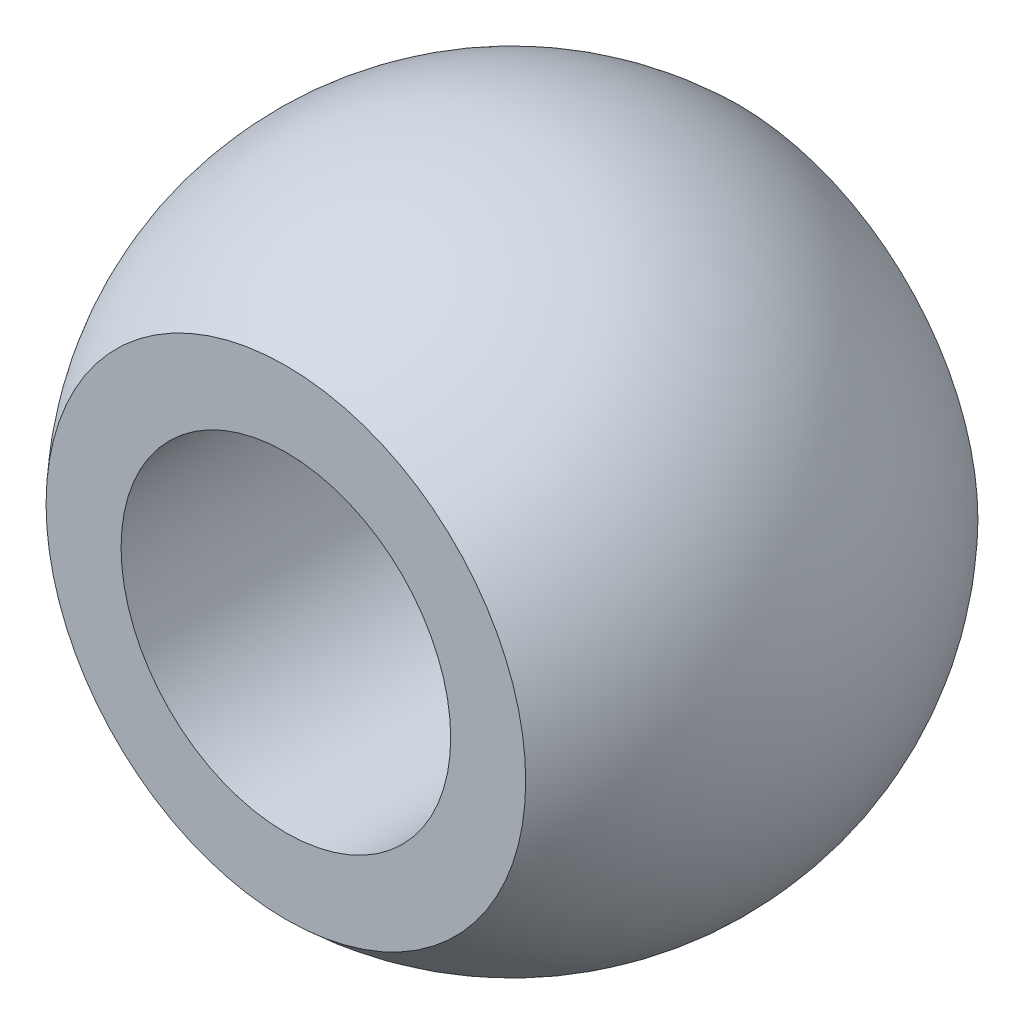
ISO-10303-21;
HEADER;
FILE_DESCRIPTION(('STEP AP214'),'2;1');
FILE_NAME('part.step','',(''),(''),'','','');
FILE_SCHEMA(('AUTOMOTIVE_DESIGN { 1 0 10303 214 1 1 1 1 }'));
ENDSEC;
DATA;
#1=APPLICATION_CONTEXT('core data for automotive mechanical design processes');
#2=APPLICATION_PROTOCOL_DEFINITION('international standard','automotive_design',2000,#1);
#3=PRODUCT_CONTEXT('',#1,'mechanical');
#4=PRODUCT('Part','Part','',(#3));
#5=PRODUCT_RELATED_PRODUCT_CATEGORY('part','',(#4));
#6=PRODUCT_DEFINITION_FORMATION('','',#4);
#7=PRODUCT_DEFINITION_CONTEXT('part definition',#1,'design');
#8=PRODUCT_DEFINITION('design','',#6,#7);
#9=PRODUCT_DEFINITION_SHAPE('','',#8);
#10=(LENGTH_UNIT() NAMED_UNIT(*) SI_UNIT(.MILLI.,.METRE.));
#11=(NAMED_UNIT(*) PLANE_ANGLE_UNIT() SI_UNIT($,.RADIAN.));
#12=(NAMED_UNIT(*) SI_UNIT($,.STERADIAN.) SOLID_ANGLE_UNIT());
#13=UNCERTAINTY_MEASURE_WITH_UNIT(LENGTH_MEASURE(1.E-05),#10,'distance_accuracy_value','');
#14=(GEOMETRIC_REPRESENTATION_CONTEXT(3) GLOBAL_UNCERTAINTY_ASSIGNED_CONTEXT((#13)) GLOBAL_UNIT_ASSIGNED_CONTEXT((#10,
#11,#12)) REPRESENTATION_CONTEXT('',''));
#15=CARTESIAN_POINT('',(0.,0.,0.));
#16=DIRECTION('',(0.,0.,1.));
#17=DIRECTION('',(1.,0.,0.));
#18=AXIS2_PLACEMENT_3D('',#15,#16,#17);
#19=CARTESIAN_POINT('',(0.,0.,0.));
#20=DIRECTION('',(0.,-1.,0.));
#21=DIRECTION('',(-1.,0.,0.));
#22=AXIS2_PLACEMENT_3D('',#19,#20,#21);
#23=SPHERICAL_SURFACE('',#22,6.35);
#24=CARTESIAN_POINT('',(0.,0.,0.));
#25=DIRECTION('',(0.,0.,1.));
#26=DIRECTION('',(1.,0.,0.));
#27=AXIS2_PLACEMENT_3D('',#24,#25,#26);
#28=SPHERICAL_SURFACE('',#27,6.35);
#29=CARTESIAN_POINT('',(0.,0.,-4.3561));
#30=DIRECTION('',(0.,0.,1.));
#31=DIRECTION('',(1.,0.,0.));
#32=AXIS2_PLACEMENT_3D('',#29,#30,#31);
#33=CIRCLE('',#32,4.62026977459109);
#34=CARTESIAN_POINT('',(4.62026977459109,0.,-4.3561));
#35=VERTEX_POINT('',#34);
#36=EDGE_CURVE('E47',#35,#35,#33,.F.);
#37=ORIENTED_EDGE('',*,*,#36,.F.);
#38=EDGE_LOOP('',(#37));
#39=FACE_BOUND('',#38,.T.);
#40=CARTESIAN_POINT('',(0.,0.,4.3561));
#41=DIRECTION('',(0.,0.,-1.));
#42=DIRECTION('',(-1.,0.,0.));
#43=AXIS2_PLACEMENT_3D('',#40,#41,#42);
#44=CIRCLE('',#43,4.62026977459109);
#45=CARTESIAN_POINT('',(-4.62026977459109,0.,4.3561));
#46=VERTEX_POINT('',#45);
#47=EDGE_CURVE('E10',#46,#46,#44,.F.);
#48=ORIENTED_EDGE('',*,*,#47,.F.);
#49=EDGE_LOOP('',(#48));
#50=FACE_BOUND('',#49,.T.);
#51=ADVANCED_FACE('F35',(#39,#50),#28,.T.);
#52=CARTESIAN_POINT('',(0.,0.,-6.35));
#53=DIRECTION('',(0.,0.,1.));
#54=DIRECTION('',(1.,0.,0.));
#55=AXIS2_PLACEMENT_3D('',#52,#53,#54);
#56=CYLINDRICAL_SURFACE('',#55,3.175);
#57=CARTESIAN_POINT('',(0.,0.,-4.3561));
#58=DIRECTION('',(0.,0.,1.));
#59=DIRECTION('',(1.,0.,0.));
#60=AXIS2_PLACEMENT_3D('',#57,#58,#59);
#61=CIRCLE('',#60,3.175);
#62=CARTESIAN_POINT('',(3.175,0.,-4.3561));
#63=VERTEX_POINT('',#62);
#64=EDGE_CURVE('E38',#63,#63,#61,.F.);
#65=ORIENTED_EDGE('',*,*,#64,.T.);
#66=EDGE_LOOP('',(#65));
#67=FACE_BOUND('',#66,.T.);
#68=CARTESIAN_POINT('',(0.,0.,4.3561));
#69=DIRECTION('',(0.,0.,-1.));
#70=DIRECTION('',(-1.,0.,0.));
#71=AXIS2_PLACEMENT_3D('',#68,#69,#70);
#72=CIRCLE('',#71,3.175);
#73=CARTESIAN_POINT('',(-3.175,0.,4.3561));
#74=VERTEX_POINT('',#73);
#75=EDGE_CURVE('E42',#74,#74,#72,.F.);
#76=ORIENTED_EDGE('',*,*,#75,.T.);
#77=EDGE_LOOP('',(#76));
#78=FACE_BOUND('',#77,.T.);
#79=ADVANCED_FACE('F55',(#67,#78),#56,.F.);
#80=CARTESIAN_POINT('',(-8.33374,8.33374,4.3561));
#81=DIRECTION('',(0.,0.,-1.));
#82=DIRECTION('',(-1.,0.,0.));
#83=AXIS2_PLACEMENT_3D('',#80,#81,#82);
#84=PLANE('',#83);
#85=ORIENTED_EDGE('',*,*,#47,.T.);
#86=EDGE_LOOP('',(#85));
#87=FACE_BOUND('',#86,.T.);
#88=ORIENTED_EDGE('',*,*,#75,.F.);
#89=EDGE_LOOP('',(#88));
#90=FACE_BOUND('',#89,.T.);
#91=ADVANCED_FACE('F60',(#87,#90),#84,.F.);
#92=CARTESIAN_POINT('',(-8.33374,-8.33374,-4.3561));
#93=DIRECTION('',(0.,0.,1.));
#94=DIRECTION('',(1.,0.,0.));
#95=AXIS2_PLACEMENT_3D('',#92,#93,#94);
#96=PLANE('',#95);
#97=ORIENTED_EDGE('',*,*,#36,.T.);
#98=EDGE_LOOP('',(#97));
#99=FACE_BOUND('',#98,.T.);
#100=ORIENTED_EDGE('',*,*,#64,.F.);
#101=EDGE_LOOP('',(#100));
#102=FACE_BOUND('',#101,.T.);
#103=ADVANCED_FACE('F58',(#99,#102),#96,.F.);
#104=CLOSED_SHELL('',(#51,#79,#91,#103));
#105=MANIFOLD_SOLID_BREP('B2',#104);
#106=ADVANCED_BREP_SHAPE_REPRESENTATION('',(#18,#105),#14);
#107=SHAPE_DEFINITION_REPRESENTATION(#9,#106);
ENDSEC;
END-ISO-10303-21;
